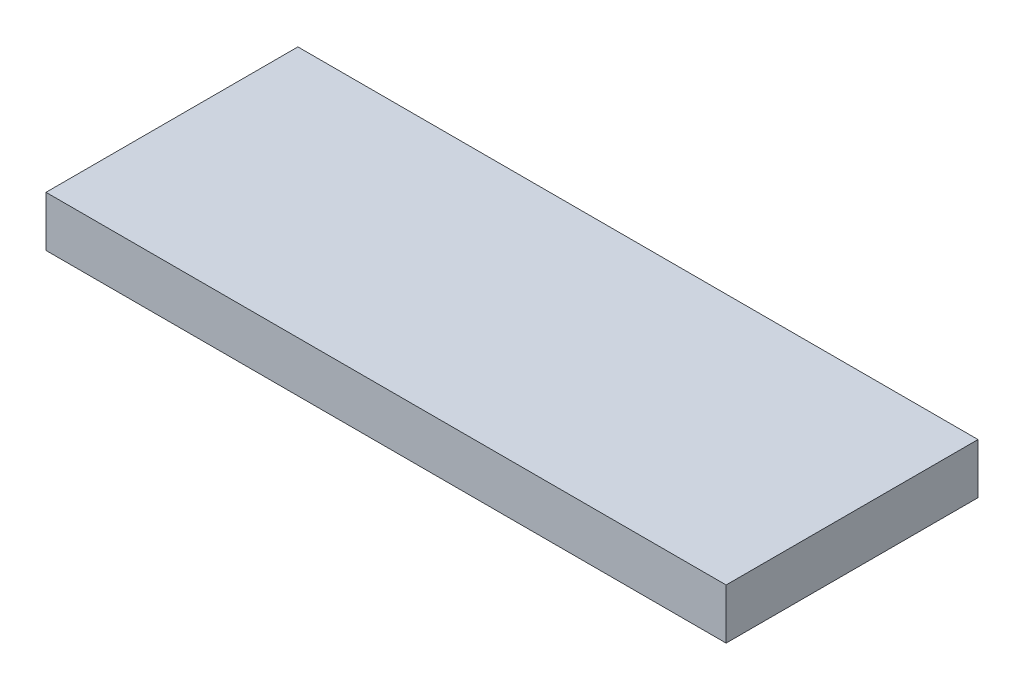
ISO-10303-21;
HEADER;
FILE_DESCRIPTION(('STEP AP214'),'2;1');
FILE_NAME('part.step','',(''),(''),'','','');
FILE_SCHEMA(('AUTOMOTIVE_DESIGN { 1 0 10303 214 1 1 1 1 }'));
ENDSEC;
DATA;
#1=APPLICATION_CONTEXT('core data for automotive mechanical design processes');
#2=APPLICATION_PROTOCOL_DEFINITION('international standard','automotive_design',2000,#1);
#3=PRODUCT_CONTEXT('',#1,'mechanical');
#4=PRODUCT('Part','Part','',(#3));
#5=PRODUCT_RELATED_PRODUCT_CATEGORY('part','',(#4));
#6=PRODUCT_DEFINITION_FORMATION('','',#4);
#7=PRODUCT_DEFINITION_CONTEXT('part definition',#1,'design');
#8=PRODUCT_DEFINITION('design','',#6,#7);
#9=PRODUCT_DEFINITION_SHAPE('','',#8);
#10=(LENGTH_UNIT() NAMED_UNIT(*) SI_UNIT(.MILLI.,.METRE.));
#11=(NAMED_UNIT(*) PLANE_ANGLE_UNIT() SI_UNIT($,.RADIAN.));
#12=(NAMED_UNIT(*) SI_UNIT($,.STERADIAN.) SOLID_ANGLE_UNIT());
#13=UNCERTAINTY_MEASURE_WITH_UNIT(LENGTH_MEASURE(1.E-05),#10,'distance_accuracy_value','');
#14=(GEOMETRIC_REPRESENTATION_CONTEXT(3) GLOBAL_UNCERTAINTY_ASSIGNED_CONTEXT((#13)) GLOBAL_UNIT_ASSIGNED_CONTEXT((#10,
#11,#12)) REPRESENTATION_CONTEXT('',''));
#15=CARTESIAN_POINT('',(0.,0.,0.));
#16=DIRECTION('',(0.,0.,1.));
#17=DIRECTION('',(1.,0.,0.));
#18=AXIS2_PLACEMENT_3D('',#15,#16,#17);
#19=CARTESIAN_POINT('',(0.,4.,0.));
#20=DIRECTION('',(1.,0.,0.));
#21=DIRECTION('',(0.,0.,-1.));
#22=AXIS2_PLACEMENT_3D('',#19,#20,#21);
#23=PLANE('',#22);
#24=DIRECTION('',(0.,0.,1.));
#25=VECTOR('',#24,1.);
#26=CARTESIAN_POINT('',(0.,0.,0.));
#27=LINE('',#26,#25);
#28=CARTESIAN_POINT('',(0.,0.,0.));
#29=VERTEX_POINT('',#28);
#30=CARTESIAN_POINT('',(0.,0.,20.));
#31=VERTEX_POINT('',#30);
#32=EDGE_CURVE('E96',#29,#31,#27,.T.);
#33=ORIENTED_EDGE('',*,*,#32,.T.);
#34=DIRECTION('',(0.,-1.,0.));
#35=VECTOR('',#34,1.);
#36=CARTESIAN_POINT('',(0.,4.,20.));
#37=LINE('',#36,#35);
#38=CARTESIAN_POINT('',(0.,4.,20.));
#39=VERTEX_POINT('',#38);
#40=EDGE_CURVE('E11',#39,#31,#37,.T.);
#41=ORIENTED_EDGE('',*,*,#40,.F.);
#42=DIRECTION('',(0.,0.,1.));
#43=VECTOR('',#42,1.);
#44=CARTESIAN_POINT('',(0.,4.,0.));
#45=LINE('',#44,#43);
#46=CARTESIAN_POINT('',(0.,4.,0.));
#47=VERTEX_POINT('',#46);
#48=EDGE_CURVE('E84',#47,#39,#45,.T.);
#49=ORIENTED_EDGE('',*,*,#48,.F.);
#50=DIRECTION('',(0.,-1.,0.));
#51=VECTOR('',#50,1.);
#52=CARTESIAN_POINT('',(0.,4.,0.));
#53=LINE('',#52,#51);
#54=EDGE_CURVE('E92',#47,#29,#53,.T.);
#55=ORIENTED_EDGE('',*,*,#54,.T.);
#56=EDGE_LOOP('',(#33,#41,#49,#55));
#57=FACE_BOUND('',#56,.T.);
#58=ADVANCED_FACE('F33',(#57),#23,.F.);
#59=CARTESIAN_POINT('',(0.,4.,20.));
#60=DIRECTION('',(0.,0.,-1.));
#61=DIRECTION('',(-1.,0.,0.));
#62=AXIS2_PLACEMENT_3D('',#59,#60,#61);
#63=PLANE('',#62);
#64=DIRECTION('',(1.,0.,0.));
#65=VECTOR('',#64,1.);
#66=CARTESIAN_POINT('',(0.,0.,20.));
#67=LINE('',#66,#65);
#68=CARTESIAN_POINT('',(54.,0.,20.));
#69=VERTEX_POINT('',#68);
#70=EDGE_CURVE('E88',#31,#69,#67,.T.);
#71=ORIENTED_EDGE('',*,*,#70,.T.);
#72=DIRECTION('',(0.,-1.,0.));
#73=VECTOR('',#72,1.);
#74=CARTESIAN_POINT('',(54.,4.,20.));
#75=LINE('',#74,#73);
#76=CARTESIAN_POINT('',(54.,4.,20.));
#77=VERTEX_POINT('',#76);
#78=EDGE_CURVE('E41',#77,#69,#75,.T.);
#79=ORIENTED_EDGE('',*,*,#78,.F.);
#80=DIRECTION('',(1.,0.,0.));
#81=VECTOR('',#80,1.);
#82=CARTESIAN_POINT('',(0.,4.,20.));
#83=LINE('',#82,#81);
#84=EDGE_CURVE('E79',#39,#77,#83,.T.);
#85=ORIENTED_EDGE('',*,*,#84,.F.);
#86=ORIENTED_EDGE('',*,*,#40,.T.);
#87=EDGE_LOOP('',(#71,#79,#85,#86));
#88=FACE_BOUND('',#87,.T.);
#89=ADVANCED_FACE('F87',(#88),#63,.F.);
#90=CARTESIAN_POINT('',(54.,4.,0.));
#91=DIRECTION('',(-1.,0.,0.));
#92=DIRECTION('',(0.,0.,1.));
#93=AXIS2_PLACEMENT_3D('',#90,#91,#92);
#94=PLANE('',#93);
#95=DIRECTION('',(0.,0.,-1.));
#96=VECTOR('',#95,1.);
#97=CARTESIAN_POINT('',(54.,0.,0.));
#98=LINE('',#97,#96);
#99=CARTESIAN_POINT('',(54.,0.,0.));
#100=VERTEX_POINT('',#99);
#101=EDGE_CURVE('E66',#69,#100,#98,.T.);
#102=ORIENTED_EDGE('',*,*,#101,.T.);
#103=DIRECTION('',(0.,-1.,0.));
#104=VECTOR('',#103,1.);
#105=CARTESIAN_POINT('',(54.,4.,0.));
#106=LINE('',#105,#104);
#107=CARTESIAN_POINT('',(54.,4.,0.));
#108=VERTEX_POINT('',#107);
#109=EDGE_CURVE('E89',#108,#100,#106,.T.);
#110=ORIENTED_EDGE('',*,*,#109,.F.);
#111=DIRECTION('',(0.,0.,-1.));
#112=VECTOR('',#111,1.);
#113=CARTESIAN_POINT('',(54.,4.,0.));
#114=LINE('',#113,#112);
#115=EDGE_CURVE('E82',#77,#108,#114,.T.);
#116=ORIENTED_EDGE('',*,*,#115,.F.);
#117=ORIENTED_EDGE('',*,*,#78,.T.);
#118=EDGE_LOOP('',(#102,#110,#116,#117));
#119=FACE_BOUND('',#118,.T.);
#120=ADVANCED_FACE('F90',(#119),#94,.F.);
#121=CARTESIAN_POINT('',(0.,4.,0.));
#122=DIRECTION('',(0.,0.,1.));
#123=DIRECTION('',(1.,0.,0.));
#124=AXIS2_PLACEMENT_3D('',#121,#122,#123);
#125=PLANE('',#124);
#126=DIRECTION('',(-1.,0.,0.));
#127=VECTOR('',#126,1.);
#128=CARTESIAN_POINT('',(0.,0.,0.));
#129=LINE('',#128,#127);
#130=EDGE_CURVE('E72',#100,#29,#129,.T.);
#131=ORIENTED_EDGE('',*,*,#130,.T.);
#132=ORIENTED_EDGE('',*,*,#54,.F.);
#133=DIRECTION('',(-1.,0.,0.));
#134=VECTOR('',#133,1.);
#135=CARTESIAN_POINT('',(0.,4.,0.));
#136=LINE('',#135,#134);
#137=EDGE_CURVE('E49',#108,#47,#136,.T.);
#138=ORIENTED_EDGE('',*,*,#137,.F.);
#139=ORIENTED_EDGE('',*,*,#109,.T.);
#140=EDGE_LOOP('',(#131,#132,#138,#139));
#141=FACE_BOUND('',#140,.T.);
#142=ADVANCED_FACE('F103',(#141),#125,.F.);
#143=CARTESIAN_POINT('',(0.,4.,0.));
#144=DIRECTION('',(0.,1.,0.));
#145=DIRECTION('',(0.,0.,1.));
#146=AXIS2_PLACEMENT_3D('',#143,#144,#145);
#147=PLANE('',#146);
#148=ORIENTED_EDGE('',*,*,#48,.T.);
#149=ORIENTED_EDGE('',*,*,#84,.T.);
#150=ORIENTED_EDGE('',*,*,#115,.T.);
#151=ORIENTED_EDGE('',*,*,#137,.T.);
#152=EDGE_LOOP('',(#148,#149,#150,#151));
#153=FACE_BOUND('',#152,.T.);
#154=ADVANCED_FACE('F80',(#153),#147,.T.);
#155=CARTESIAN_POINT('',(0.,0.,0.));
#156=DIRECTION('',(0.,1.,0.));
#157=DIRECTION('',(0.,0.,1.));
#158=AXIS2_PLACEMENT_3D('',#155,#156,#157);
#159=PLANE('',#158);
#160=ORIENTED_EDGE('',*,*,#32,.F.);
#161=ORIENTED_EDGE('',*,*,#130,.F.);
#162=ORIENTED_EDGE('',*,*,#101,.F.);
#163=ORIENTED_EDGE('',*,*,#70,.F.);
#164=EDGE_LOOP('',(#160,#161,#162,#163));
#165=FACE_BOUND('',#164,.T.);
#166=ADVANCED_FACE('F106',(#165),#159,.F.);
#167=CLOSED_SHELL('',(#58,#89,#120,#142,#154,#166));
#168=MANIFOLD_SOLID_BREP('B2',#167);
#169=ADVANCED_BREP_SHAPE_REPRESENTATION('',(#18,#168),#14);
#170=SHAPE_DEFINITION_REPRESENTATION(#9,#169);
ENDSEC;
END-ISO-10303-21;
